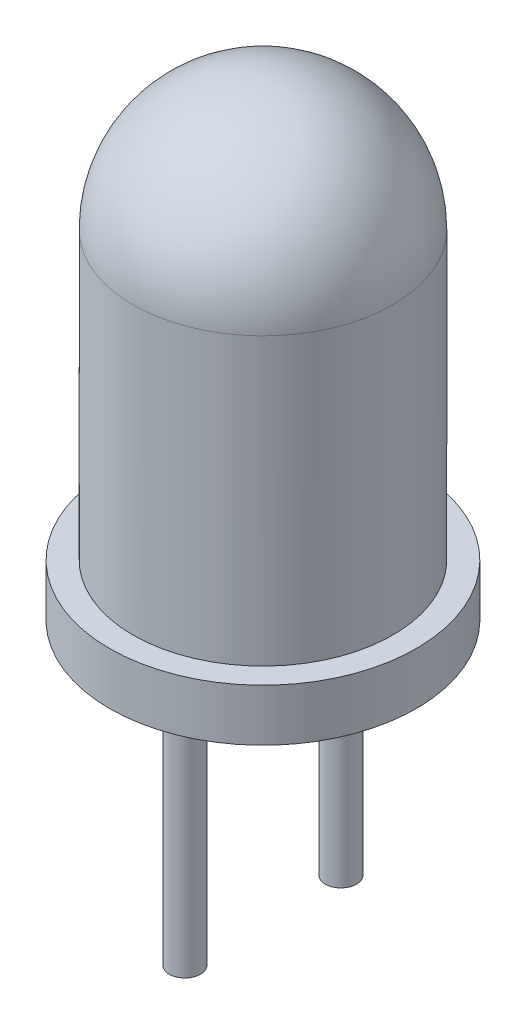
ISO-10303-21;
HEADER;
FILE_DESCRIPTION(('STEP AP214'),'2;1');
FILE_NAME('part.step','',(''),(''),'','','');
FILE_SCHEMA(('AUTOMOTIVE_DESIGN { 1 0 10303 214 1 1 1 1 }'));
ENDSEC;
DATA;
#1=APPLICATION_CONTEXT('core data for automotive mechanical design processes');
#2=APPLICATION_PROTOCOL_DEFINITION('international standard','automotive_design',2000,#1);
#3=PRODUCT_CONTEXT('',#1,'mechanical');
#4=PRODUCT('Part','Part','',(#3));
#5=PRODUCT_RELATED_PRODUCT_CATEGORY('part','',(#4));
#6=PRODUCT_DEFINITION_FORMATION('','',#4);
#7=PRODUCT_DEFINITION_CONTEXT('part definition',#1,'design');
#8=PRODUCT_DEFINITION('design','',#6,#7);
#9=PRODUCT_DEFINITION_SHAPE('','',#8);
#10=(LENGTH_UNIT() NAMED_UNIT(*) SI_UNIT(.MILLI.,.METRE.));
#11=(NAMED_UNIT(*) PLANE_ANGLE_UNIT() SI_UNIT($,.RADIAN.));
#12=(NAMED_UNIT(*) SI_UNIT($,.STERADIAN.) SOLID_ANGLE_UNIT());
#13=UNCERTAINTY_MEASURE_WITH_UNIT(LENGTH_MEASURE(1.E-05),#10,'distance_accuracy_value','');
#14=(GEOMETRIC_REPRESENTATION_CONTEXT(3) GLOBAL_UNCERTAINTY_ASSIGNED_CONTEXT((#13)) GLOBAL_UNIT_ASSIGNED_CONTEXT((#10,
#11,#12)) REPRESENTATION_CONTEXT('',''));
#15=CARTESIAN_POINT('',(0.,0.,0.));
#16=DIRECTION('',(0.,0.,1.));
#17=DIRECTION('',(1.,0.,0.));
#18=AXIS2_PLACEMENT_3D('',#15,#16,#17);
#19=CARTESIAN_POINT('',(0.,1.,0.));
#20=DIRECTION('',(0.,-1.,0.));
#21=DIRECTION('',(0.,0.,-1.));
#22=AXIS2_PLACEMENT_3D('',#19,#20,#21);
#23=CYLINDRICAL_SURFACE('',#22,2.95);
#24=CARTESIAN_POINT('',(0.,1.,0.));
#25=DIRECTION('',(0.,1.,0.));
#26=DIRECTION('',(0.,0.,1.));
#27=AXIS2_PLACEMENT_3D('',#24,#25,#26);
#28=CIRCLE('',#27,2.95);
#29=CARTESIAN_POINT('',(0.,1.,2.95));
#30=VERTEX_POINT('',#29);
#31=EDGE_CURVE('E41',#30,#30,#28,.T.);
#32=ORIENTED_EDGE('',*,*,#31,.F.);
#33=EDGE_LOOP('',(#32));
#34=FACE_BOUND('',#33,.T.);
#35=CARTESIAN_POINT('',(0.,0.,0.));
#36=DIRECTION('',(0.,1.,0.));
#37=DIRECTION('',(0.,0.,1.));
#38=AXIS2_PLACEMENT_3D('',#35,#36,#37);
#39=CIRCLE('',#38,2.95);
#40=CARTESIAN_POINT('',(0.,0.,2.95));
#41=VERTEX_POINT('',#40);
#42=EDGE_CURVE('E45',#41,#41,#39,.T.);
#43=ORIENTED_EDGE('',*,*,#42,.T.);
#44=EDGE_LOOP('',(#43));
#45=FACE_BOUND('',#44,.T.);
#46=ADVANCED_FACE('F31',(#34,#45),#23,.T.);
#47=CARTESIAN_POINT('',(0.,1.,0.));
#48=DIRECTION('',(0.,1.,0.));
#49=DIRECTION('',(0.,0.,1.));
#50=AXIS2_PLACEMENT_3D('',#47,#48,#49);
#51=PLANE('',#50);
#52=CARTESIAN_POINT('',(0.,1.,0.));
#53=DIRECTION('',(0.,1.,0.));
#54=DIRECTION('',(0.,0.,1.));
#55=AXIS2_PLACEMENT_3D('',#52,#53,#54);
#56=CIRCLE('',#55,2.5);
#57=CARTESIAN_POINT('',(0.,1.,2.5));
#58=VERTEX_POINT('',#57);
#59=EDGE_CURVE('E37',#58,#58,#56,.T.);
#60=ORIENTED_EDGE('',*,*,#59,.F.);
#61=EDGE_LOOP('',(#60));
#62=FACE_BOUND('',#61,.T.);
#63=ORIENTED_EDGE('',*,*,#31,.T.);
#64=EDGE_LOOP('',(#63));
#65=FACE_BOUND('',#64,.T.);
#66=ADVANCED_FACE('F75',(#62,#65),#51,.T.);
#67=CARTESIAN_POINT('',(0.,0.,0.));
#68=DIRECTION('',(0.,1.,0.));
#69=DIRECTION('',(0.,0.,1.));
#70=AXIS2_PLACEMENT_3D('',#67,#68,#69);
#71=PLANE('',#70);
#72=CARTESIAN_POINT('',(0.,0.,-1.5));
#73=DIRECTION('',(0.,1.,0.));
#74=DIRECTION('',(0.,0.,1.));
#75=AXIS2_PLACEMENT_3D('',#72,#73,#74);
#76=CIRCLE('',#75,0.3);
#77=CARTESIAN_POINT('',(0.,0.,-1.2));
#78=VERTEX_POINT('',#77);
#79=EDGE_CURVE('E57',#78,#78,#76,.T.);
#80=ORIENTED_EDGE('',*,*,#79,.T.);
#81=EDGE_LOOP('',(#80));
#82=FACE_BOUND('',#81,.T.);
#83=CARTESIAN_POINT('',(0.,0.,1.5));
#84=DIRECTION('',(0.,1.,0.));
#85=DIRECTION('',(0.,0.,1.));
#86=AXIS2_PLACEMENT_3D('',#83,#84,#85);
#87=CIRCLE('',#86,0.3);
#88=CARTESIAN_POINT('',(0.,0.,1.8));
#89=VERTEX_POINT('',#88);
#90=EDGE_CURVE('E10',#89,#89,#87,.F.);
#91=ORIENTED_EDGE('',*,*,#90,.F.);
#92=EDGE_LOOP('',(#91));
#93=FACE_BOUND('',#92,.T.);
#94=ORIENTED_EDGE('',*,*,#42,.F.);
#95=EDGE_LOOP('',(#94));
#96=FACE_BOUND('',#95,.T.);
#97=ADVANCED_FACE('F80',(#82,#93,#96),#71,.F.);
#98=CARTESIAN_POINT('',(0.,1.,0.));
#99=DIRECTION('',(0.,-1.,0.));
#100=DIRECTION('',(0.,0.,-1.));
#101=AXIS2_PLACEMENT_3D('',#98,#99,#100);
#102=CYLINDRICAL_SURFACE('',#101,2.5);
#103=CARTESIAN_POINT('',(0.,6.5,0.));
#104=DIRECTION('',(0.,-1.,0.));
#105=DIRECTION('',(0.,0.,-1.));
#106=AXIS2_PLACEMENT_3D('',#103,#104,#105);
#107=CIRCLE('',#106,2.5);
#108=CARTESIAN_POINT('',(0.,6.5,-2.5));
#109=VERTEX_POINT('',#108);
#110=EDGE_CURVE('E49',#109,#109,#107,.T.);
#111=ORIENTED_EDGE('',*,*,#110,.T.);
#112=EDGE_LOOP('',(#111));
#113=FACE_BOUND('',#112,.T.);
#114=ORIENTED_EDGE('',*,*,#59,.T.);
#115=EDGE_LOOP('',(#114));
#116=FACE_BOUND('',#115,.T.);
#117=ADVANCED_FACE('F88',(#113,#116),#102,.T.);
#118=CARTESIAN_POINT('',(0.,6.5,0.));
#119=DIRECTION('',(0.,-1.,0.));
#120=DIRECTION('',(1.,0.,0.));
#121=AXIS2_PLACEMENT_3D('',#118,#119,#120);
#122=SPHERICAL_SURFACE('',#121,2.5);
#123=ORIENTED_EDGE('',*,*,#110,.F.);
#124=EDGE_LOOP('',(#123));
#125=FACE_BOUND('',#124,.T.);
#126=ADVANCED_FACE('F93',(#125),#122,.T.);
#127=CARTESIAN_POINT('',(0.,-5.,1.5));
#128=DIRECTION('',(0.,1.,0.));
#129=DIRECTION('',(0.,0.,1.));
#130=AXIS2_PLACEMENT_3D('',#127,#128,#129);
#131=CYLINDRICAL_SURFACE('',#130,0.3);
#132=CARTESIAN_POINT('',(0.,-5.,1.5));
#133=DIRECTION('',(0.,-1.,0.));
#134=DIRECTION('',(0.,0.,-1.));
#135=AXIS2_PLACEMENT_3D('',#132,#133,#134);
#136=CIRCLE('',#135,0.3);
#137=CARTESIAN_POINT('',(0.,-5.,1.2));
#138=VERTEX_POINT('',#137);
#139=EDGE_CURVE('E53',#138,#138,#136,.T.);
#140=ORIENTED_EDGE('',*,*,#139,.F.);
#141=EDGE_LOOP('',(#140));
#142=FACE_BOUND('',#141,.T.);
#143=ORIENTED_EDGE('',*,*,#90,.T.);
#144=EDGE_LOOP('',(#143));
#145=FACE_BOUND('',#144,.T.);
#146=ADVANCED_FACE('F100',(#142,#145),#131,.T.);
#147=CARTESIAN_POINT('',(0.,-5.,1.5));
#148=DIRECTION('',(0.,-1.,0.));
#149=DIRECTION('',(0.,0.,-1.));
#150=AXIS2_PLACEMENT_3D('',#147,#148,#149);
#151=PLANE('',#150);
#152=ORIENTED_EDGE('',*,*,#139,.T.);
#153=EDGE_LOOP('',(#152));
#154=FACE_BOUND('',#153,.T.);
#155=ADVANCED_FACE('F72',(#154),#151,.T.);
#156=CARTESIAN_POINT('',(0.,-5.,-1.5));
#157=DIRECTION('',(0.,1.,0.));
#158=DIRECTION('',(0.,0.,1.));
#159=AXIS2_PLACEMENT_3D('',#156,#157,#158);
#160=CYLINDRICAL_SURFACE('',#159,0.3);
#161=CARTESIAN_POINT('',(0.,-5.,-1.5));
#162=DIRECTION('',(0.,1.,0.));
#163=DIRECTION('',(0.,0.,1.));
#164=AXIS2_PLACEMENT_3D('',#161,#162,#163);
#165=CIRCLE('',#164,0.3);
#166=CARTESIAN_POINT('',(0.,-5.,-1.2));
#167=VERTEX_POINT('',#166);
#168=EDGE_CURVE('E56',#167,#167,#165,.T.);
#169=ORIENTED_EDGE('',*,*,#168,.T.);
#170=EDGE_LOOP('',(#169));
#171=FACE_BOUND('',#170,.T.);
#172=ORIENTED_EDGE('',*,*,#79,.F.);
#173=EDGE_LOOP('',(#172));
#174=FACE_BOUND('',#173,.T.);
#175=ADVANCED_FACE('F63',(#171,#174),#160,.T.);
#176=CARTESIAN_POINT('',(0.,-5.,-1.5));
#177=DIRECTION('',(0.,-1.,0.));
#178=DIRECTION('',(0.,0.,1.));
#179=AXIS2_PLACEMENT_3D('',#176,#177,#178);
#180=PLANE('',#179);
#181=ORIENTED_EDGE('',*,*,#168,.F.);
#182=EDGE_LOOP('',(#181));
#183=FACE_BOUND('',#182,.T.);
#184=ADVANCED_FACE('F66',(#183),#180,.T.);
#185=CLOSED_SHELL('',(#46,#66,#97,#117,#126,#146,#155,#175,#184));
#186=MANIFOLD_SOLID_BREP('B2',#185);
#187=ADVANCED_BREP_SHAPE_REPRESENTATION('',(#18,#186),#14);
#188=SHAPE_DEFINITION_REPRESENTATION(#9,#187);
ENDSEC;
END-ISO-10303-21;
